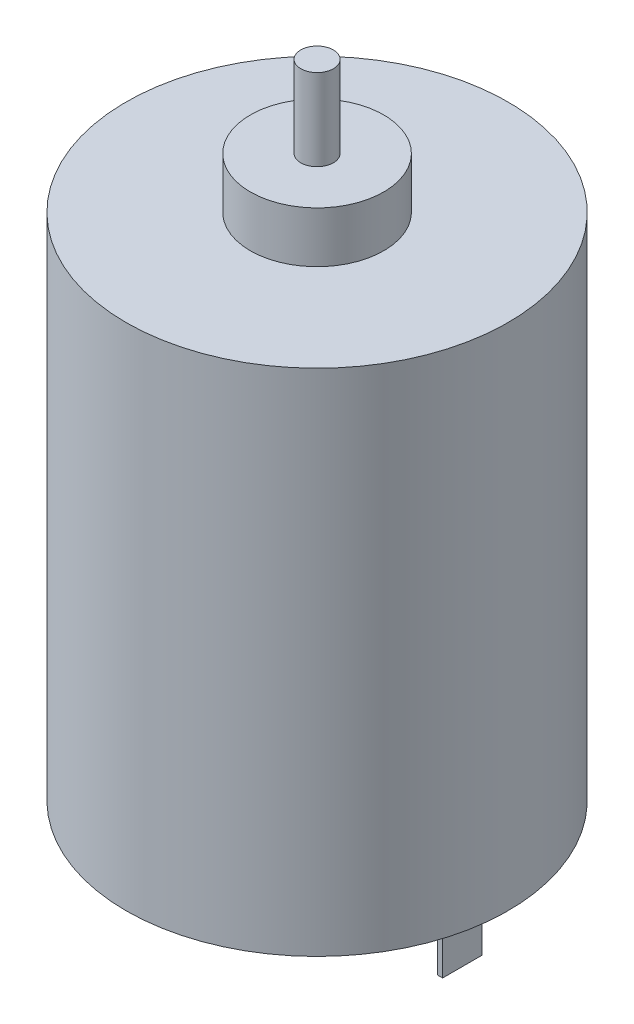
ISO-10303-21;
HEADER;
FILE_DESCRIPTION(('STEP AP214'),'2;1');
FILE_NAME('part.step','',(''),(''),'','','');
FILE_SCHEMA(('AUTOMOTIVE_DESIGN { 1 0 10303 214 1 1 1 1 }'));
ENDSEC;
DATA;
#1=APPLICATION_CONTEXT('core data for automotive mechanical design processes');
#2=APPLICATION_PROTOCOL_DEFINITION('international standard','automotive_design',2000,#1);
#3=PRODUCT_CONTEXT('',#1,'mechanical');
#4=PRODUCT('Part','Part','',(#3));
#5=PRODUCT_RELATED_PRODUCT_CATEGORY('part','',(#4));
#6=PRODUCT_DEFINITION_FORMATION('','',#4);
#7=PRODUCT_DEFINITION_CONTEXT('part definition',#1,'design');
#8=PRODUCT_DEFINITION('design','',#6,#7);
#9=PRODUCT_DEFINITION_SHAPE('','',#8);
#10=(LENGTH_UNIT() NAMED_UNIT(*) SI_UNIT(.MILLI.,.METRE.));
#11=(NAMED_UNIT(*) PLANE_ANGLE_UNIT() SI_UNIT($,.RADIAN.));
#12=(NAMED_UNIT(*) SI_UNIT($,.STERADIAN.) SOLID_ANGLE_UNIT());
#13=UNCERTAINTY_MEASURE_WITH_UNIT(LENGTH_MEASURE(1.E-05),#10,'distance_accuracy_value','');
#14=(GEOMETRIC_REPRESENTATION_CONTEXT(3) GLOBAL_UNCERTAINTY_ASSIGNED_CONTEXT((#13)) GLOBAL_UNIT_ASSIGNED_CONTEXT((#10,
#11,#12)) REPRESENTATION_CONTEXT('',''));
#15=CARTESIAN_POINT('',(0.,0.,0.));
#16=DIRECTION('',(0.,0.,1.));
#17=DIRECTION('',(1.,0.,0.));
#18=AXIS2_PLACEMENT_3D('',#15,#16,#17);
#19=CARTESIAN_POINT('',(0.,0.,0.));
#20=DIRECTION('',(0.,1.,0.));
#21=DIRECTION('',(0.,0.,1.));
#22=AXIS2_PLACEMENT_3D('',#19,#20,#21);
#23=PLANE('',#22);
#24=DIRECTION('',(0.,0.,-1.));
#25=VECTOR('',#24,1.);
#26=CARTESIAN_POINT('',(-14.25,0.,-1.92499999999999));
#27=LINE('',#26,#25);
#28=CARTESIAN_POINT('',(-14.25,0.,1.92500000000001));
#29=VERTEX_POINT('',#28);
#30=CARTESIAN_POINT('',(-14.25,0.,-1.92499999999999));
#31=VERTEX_POINT('',#30);
#32=EDGE_CURVE('E120',#29,#31,#27,.T.);
#33=ORIENTED_EDGE('',*,*,#32,.F.);
#34=DIRECTION('',(-1.,0.,0.));
#35=VECTOR('',#34,1.);
#36=CARTESIAN_POINT('',(-13.75,0.,1.92500000000001));
#37=LINE('',#36,#35);
#38=CARTESIAN_POINT('',(-13.75,0.,1.92500000000001));
#39=VERTEX_POINT('',#38);
#40=EDGE_CURVE('E133',#39,#29,#37,.T.);
#41=ORIENTED_EDGE('',*,*,#40,.F.);
#42=DIRECTION('',(0.,0.,1.));
#43=VECTOR('',#42,1.);
#44=CARTESIAN_POINT('',(-13.75,0.,-1.92499999999999));
#45=LINE('',#44,#43);
#46=CARTESIAN_POINT('',(-13.75,0.,-1.92499999999999));
#47=VERTEX_POINT('',#46);
#48=EDGE_CURVE('E142',#47,#39,#45,.T.);
#49=ORIENTED_EDGE('',*,*,#48,.F.);
#50=DIRECTION('',(1.,0.,0.));
#51=VECTOR('',#50,1.);
#52=CARTESIAN_POINT('',(-13.75,0.,-1.92499999999999));
#53=LINE('',#52,#51);
#54=EDGE_CURVE('E123',#31,#47,#53,.T.);
#55=ORIENTED_EDGE('',*,*,#54,.F.);
#56=EDGE_LOOP('',(#33,#41,#49,#55));
#57=FACE_BOUND('',#56,.T.);
#58=CARTESIAN_POINT('',(0.,0.,0.));
#59=DIRECTION('',(0.,1.,0.));
#60=DIRECTION('',(0.,0.,1.));
#61=AXIS2_PLACEMENT_3D('',#58,#59,#60);
#62=CIRCLE('',#61,6.5);
#63=CARTESIAN_POINT('',(0.,0.,6.5));
#64=VERTEX_POINT('',#63);
#65=EDGE_CURVE('E11',#64,#64,#62,.F.);
#66=ORIENTED_EDGE('',*,*,#65,.F.);
#67=EDGE_LOOP('',(#66));
#68=FACE_BOUND('',#67,.T.);
#69=CARTESIAN_POINT('',(0.,0.,0.));
#70=DIRECTION('',(0.,1.,0.));
#71=DIRECTION('',(0.,0.,1.));
#72=AXIS2_PLACEMENT_3D('',#69,#70,#71);
#73=CIRCLE('',#72,18.75);
#74=CARTESIAN_POINT('',(0.,0.,18.75));
#75=VERTEX_POINT('',#74);
#76=EDGE_CURVE('E177',#75,#75,#73,.T.);
#77=ORIENTED_EDGE('',*,*,#76,.F.);
#78=EDGE_LOOP('',(#77));
#79=FACE_BOUND('',#78,.T.);
#80=DIRECTION('',(0.,0.,-1.));
#81=VECTOR('',#80,1.);
#82=CARTESIAN_POINT('',(13.75,0.,-1.925));
#83=LINE('',#82,#81);
#84=CARTESIAN_POINT('',(13.75,0.,1.925));
#85=VERTEX_POINT('',#84);
#86=CARTESIAN_POINT('',(13.75,0.,-1.925));
#87=VERTEX_POINT('',#86);
#88=EDGE_CURVE('E119',#85,#87,#83,.T.);
#89=ORIENTED_EDGE('',*,*,#88,.F.);
#90=DIRECTION('',(-1.,0.,0.));
#91=VECTOR('',#90,1.);
#92=CARTESIAN_POINT('',(14.25,0.,1.925));
#93=LINE('',#92,#91);
#94=CARTESIAN_POINT('',(14.25,0.,1.925));
#95=VERTEX_POINT('',#94);
#96=EDGE_CURVE('E116',#95,#85,#93,.T.);
#97=ORIENTED_EDGE('',*,*,#96,.F.);
#98=DIRECTION('',(0.,0.,1.));
#99=VECTOR('',#98,1.);
#100=CARTESIAN_POINT('',(14.25,0.,-1.925));
#101=LINE('',#100,#99);
#102=CARTESIAN_POINT('',(14.25,0.,-1.925));
#103=VERTEX_POINT('',#102);
#104=EDGE_CURVE('E54',#103,#95,#101,.T.);
#105=ORIENTED_EDGE('',*,*,#104,.F.);
#106=DIRECTION('',(1.,0.,0.));
#107=VECTOR('',#106,1.);
#108=CARTESIAN_POINT('',(14.25,0.,-1.925));
#109=LINE('',#108,#107);
#110=EDGE_CURVE('E49',#87,#103,#109,.T.);
#111=ORIENTED_EDGE('',*,*,#110,.F.);
#112=EDGE_LOOP('',(#89,#97,#105,#111));
#113=FACE_BOUND('',#112,.T.);
#114=ADVANCED_FACE('F34',(#57,#68,#79,#113),#23,.F.);
#115=CARTESIAN_POINT('',(0.,50.,0.));
#116=DIRECTION('',(0.,-1.,0.));
#117=DIRECTION('',(0.,0.,-1.));
#118=AXIS2_PLACEMENT_3D('',#115,#116,#117);
#119=CYLINDRICAL_SURFACE('',#118,18.75);
#120=CARTESIAN_POINT('',(0.,50.,0.));
#121=DIRECTION('',(0.,1.,0.));
#122=DIRECTION('',(0.,0.,1.));
#123=AXIS2_PLACEMENT_3D('',#120,#121,#122);
#124=CIRCLE('',#123,18.75);
#125=CARTESIAN_POINT('',(0.,50.,18.75));
#126=VERTEX_POINT('',#125);
#127=EDGE_CURVE('E42',#126,#126,#124,.T.);
#128=ORIENTED_EDGE('',*,*,#127,.F.);
#129=EDGE_LOOP('',(#128));
#130=FACE_BOUND('',#129,.T.);
#131=ORIENTED_EDGE('',*,*,#76,.T.);
#132=EDGE_LOOP('',(#131));
#133=FACE_BOUND('',#132,.T.);
#134=ADVANCED_FACE('F36',(#130,#133),#119,.T.);
#135=CARTESIAN_POINT('',(0.,50.,0.));
#136=DIRECTION('',(0.,1.,0.));
#137=DIRECTION('',(0.,0.,1.));
#138=AXIS2_PLACEMENT_3D('',#135,#136,#137);
#139=PLANE('',#138);
#140=CARTESIAN_POINT('',(0.,50.,0.));
#141=DIRECTION('',(0.,1.,0.));
#142=DIRECTION('',(0.,0.,1.));
#143=AXIS2_PLACEMENT_3D('',#140,#141,#142);
#144=CIRCLE('',#143,6.55);
#145=CARTESIAN_POINT('',(0.,50.,6.55));
#146=VERTEX_POINT('',#145);
#147=EDGE_CURVE('E171',#146,#146,#144,.T.);
#148=ORIENTED_EDGE('',*,*,#147,.F.);
#149=EDGE_LOOP('',(#148));
#150=FACE_BOUND('',#149,.T.);
#151=ORIENTED_EDGE('',*,*,#127,.T.);
#152=EDGE_LOOP('',(#151));
#153=FACE_BOUND('',#152,.T.);
#154=ADVANCED_FACE('F265',(#150,#153),#139,.T.);
#155=CARTESIAN_POINT('',(0.,55.,0.));
#156=DIRECTION('',(0.,-1.,0.));
#157=DIRECTION('',(0.,0.,-1.));
#158=AXIS2_PLACEMENT_3D('',#155,#156,#157);
#159=CYLINDRICAL_SURFACE('',#158,6.55);
#160=CARTESIAN_POINT('',(0.,55.,0.));
#161=DIRECTION('',(0.,1.,0.));
#162=DIRECTION('',(0.,0.,1.));
#163=AXIS2_PLACEMENT_3D('',#160,#161,#162);
#164=CIRCLE('',#163,6.55);
#165=CARTESIAN_POINT('',(0.,55.,6.55));
#166=VERTEX_POINT('',#165);
#167=EDGE_CURVE('E174',#166,#166,#164,.T.);
#168=ORIENTED_EDGE('',*,*,#167,.F.);
#169=EDGE_LOOP('',(#168));
#170=FACE_BOUND('',#169,.T.);
#171=ORIENTED_EDGE('',*,*,#147,.T.);
#172=EDGE_LOOP('',(#171));
#173=FACE_BOUND('',#172,.T.);
#174=ADVANCED_FACE('F261',(#170,#173),#159,.T.);
#175=CARTESIAN_POINT('',(0.,55.,0.));
#176=DIRECTION('',(0.,1.,0.));
#177=DIRECTION('',(0.,0.,1.));
#178=AXIS2_PLACEMENT_3D('',#175,#176,#177);
#179=PLANE('',#178);
#180=CARTESIAN_POINT('',(0.,55.,0.));
#181=DIRECTION('',(0.,1.,0.));
#182=DIRECTION('',(0.,0.,1.));
#183=AXIS2_PLACEMENT_3D('',#180,#181,#182);
#184=CIRCLE('',#183,1.6);
#185=CARTESIAN_POINT('',(0.,55.,1.6));
#186=VERTEX_POINT('',#185);
#187=EDGE_CURVE('E167',#186,#186,#184,.T.);
#188=ORIENTED_EDGE('',*,*,#187,.F.);
#189=EDGE_LOOP('',(#188));
#190=FACE_BOUND('',#189,.T.);
#191=ORIENTED_EDGE('',*,*,#167,.T.);
#192=EDGE_LOOP('',(#191));
#193=FACE_BOUND('',#192,.T.);
#194=ADVANCED_FACE('F257',(#190,#193),#179,.T.);
#195=CARTESIAN_POINT('',(0.,63.,0.));
#196=DIRECTION('',(0.,-1.,0.));
#197=DIRECTION('',(0.,0.,-1.));
#198=AXIS2_PLACEMENT_3D('',#195,#196,#197);
#199=CYLINDRICAL_SURFACE('',#198,1.6);
#200=CARTESIAN_POINT('',(0.,63.,0.));
#201=DIRECTION('',(0.,1.,0.));
#202=DIRECTION('',(0.,0.,1.));
#203=AXIS2_PLACEMENT_3D('',#200,#201,#202);
#204=CIRCLE('',#203,1.6);
#205=CARTESIAN_POINT('',(0.,63.,1.6));
#206=VERTEX_POINT('',#205);
#207=EDGE_CURVE('E168',#206,#206,#204,.T.);
#208=ORIENTED_EDGE('',*,*,#207,.F.);
#209=EDGE_LOOP('',(#208));
#210=FACE_BOUND('',#209,.T.);
#211=ORIENTED_EDGE('',*,*,#187,.T.);
#212=EDGE_LOOP('',(#211));
#213=FACE_BOUND('',#212,.T.);
#214=ADVANCED_FACE('F253',(#210,#213),#199,.T.);
#215=CARTESIAN_POINT('',(0.,63.,0.));
#216=DIRECTION('',(0.,1.,0.));
#217=DIRECTION('',(0.,0.,1.));
#218=AXIS2_PLACEMENT_3D('',#215,#216,#217);
#219=PLANE('',#218);
#220=ORIENTED_EDGE('',*,*,#207,.T.);
#221=EDGE_LOOP('',(#220));
#222=FACE_BOUND('',#221,.T.);
#223=ADVANCED_FACE('F249',(#222),#219,.T.);
#224=CARTESIAN_POINT('',(0.,-2.5,0.));
#225=DIRECTION('',(0.,1.,0.));
#226=DIRECTION('',(0.,0.,1.));
#227=AXIS2_PLACEMENT_3D('',#224,#225,#226);
#228=CYLINDRICAL_SURFACE('',#227,6.5);
#229=CARTESIAN_POINT('',(0.,-2.5,0.));
#230=DIRECTION('',(0.,-1.,0.));
#231=DIRECTION('',(0.,0.,-1.));
#232=AXIS2_PLACEMENT_3D('',#229,#230,#231);
#233=CIRCLE('',#232,6.5);
#234=CARTESIAN_POINT('',(0.,-2.5,-6.5));
#235=VERTEX_POINT('',#234);
#236=EDGE_CURVE('E162',#235,#235,#233,.T.);
#237=ORIENTED_EDGE('',*,*,#236,.F.);
#238=EDGE_LOOP('',(#237));
#239=FACE_BOUND('',#238,.T.);
#240=ORIENTED_EDGE('',*,*,#65,.T.);
#241=EDGE_LOOP('',(#240));
#242=FACE_BOUND('',#241,.T.);
#243=ADVANCED_FACE('F245',(#239,#242),#228,.T.);
#244=CARTESIAN_POINT('',(0.,-2.5,0.));
#245=DIRECTION('',(0.,-1.,0.));
#246=DIRECTION('',(0.,0.,-1.));
#247=AXIS2_PLACEMENT_3D('',#244,#245,#246);
#248=PLANE('',#247);
#249=CARTESIAN_POINT('',(0.,-2.5,0.));
#250=DIRECTION('',(0.,-1.,0.));
#251=DIRECTION('',(0.,0.,-1.));
#252=AXIS2_PLACEMENT_3D('',#249,#250,#251);
#253=CIRCLE('',#252,4.);
#254=CARTESIAN_POINT('',(0.,-2.5,-4.));
#255=VERTEX_POINT('',#254);
#256=EDGE_CURVE('E158',#255,#255,#253,.T.);
#257=ORIENTED_EDGE('',*,*,#256,.F.);
#258=EDGE_LOOP('',(#257));
#259=FACE_BOUND('',#258,.T.);
#260=ORIENTED_EDGE('',*,*,#236,.T.);
#261=EDGE_LOOP('',(#260));
#262=FACE_BOUND('',#261,.T.);
#263=ADVANCED_FACE('F241',(#259,#262),#248,.T.);
#264=CARTESIAN_POINT('',(0.,-3.8,0.));
#265=DIRECTION('',(0.,1.,0.));
#266=DIRECTION('',(0.,0.,1.));
#267=AXIS2_PLACEMENT_3D('',#264,#265,#266);
#268=CYLINDRICAL_SURFACE('',#267,4.);
#269=CARTESIAN_POINT('',(0.,-3.8,0.));
#270=DIRECTION('',(0.,-1.,0.));
#271=DIRECTION('',(0.,0.,-1.));
#272=AXIS2_PLACEMENT_3D('',#269,#270,#271);
#273=CIRCLE('',#272,4.);
#274=CARTESIAN_POINT('',(0.,-3.8,-4.));
#275=VERTEX_POINT('',#274);
#276=EDGE_CURVE('E159',#275,#275,#273,.T.);
#277=ORIENTED_EDGE('',*,*,#276,.F.);
#278=EDGE_LOOP('',(#277));
#279=FACE_BOUND('',#278,.T.);
#280=ORIENTED_EDGE('',*,*,#256,.T.);
#281=EDGE_LOOP('',(#280));
#282=FACE_BOUND('',#281,.T.);
#283=ADVANCED_FACE('F237',(#279,#282),#268,.T.);
#284=CARTESIAN_POINT('',(0.,-3.8,0.));
#285=DIRECTION('',(0.,-1.,0.));
#286=DIRECTION('',(0.,0.,-1.));
#287=AXIS2_PLACEMENT_3D('',#284,#285,#286);
#288=PLANE('',#287);
#289=ORIENTED_EDGE('',*,*,#276,.T.);
#290=EDGE_LOOP('',(#289));
#291=FACE_BOUND('',#290,.T.);
#292=ADVANCED_FACE('F233',(#291),#288,.T.);
#293=CARTESIAN_POINT('',(-14.25,-7.,-1.92499999999999));
#294=DIRECTION('',(1.,0.,0.));
#295=DIRECTION('',(0.,0.,-1.));
#296=AXIS2_PLACEMENT_3D('',#293,#294,#295);
#297=PLANE('',#296);
#298=ORIENTED_EDGE('',*,*,#32,.T.);
#299=DIRECTION('',(0.,1.,0.));
#300=VECTOR('',#299,1.);
#301=CARTESIAN_POINT('',(-14.25,-7.,-1.92499999999999));
#302=LINE('',#301,#300);
#303=CARTESIAN_POINT('',(-14.25,-7.,-1.92499999999999));
#304=VERTEX_POINT('',#303);
#305=EDGE_CURVE('E155',#304,#31,#302,.T.);
#306=ORIENTED_EDGE('',*,*,#305,.F.);
#307=DIRECTION('',(0.,0.,-1.));
#308=VECTOR('',#307,1.);
#309=CARTESIAN_POINT('',(-14.25,-7.,-1.92499999999999));
#310=LINE('',#309,#308);
#311=CARTESIAN_POINT('',(-14.25,-7.,1.92500000000001));
#312=VERTEX_POINT('',#311);
#313=EDGE_CURVE('E129',#312,#304,#310,.T.);
#314=ORIENTED_EDGE('',*,*,#313,.F.);
#315=DIRECTION('',(0.,1.,0.));
#316=VECTOR('',#315,1.);
#317=CARTESIAN_POINT('',(-14.25,-7.,1.92500000000001));
#318=LINE('',#317,#316);
#319=EDGE_CURVE('E138',#312,#29,#318,.T.);
#320=ORIENTED_EDGE('',*,*,#319,.T.);
#321=EDGE_LOOP('',(#298,#306,#314,#320));
#322=FACE_BOUND('',#321,.T.);
#323=ADVANCED_FACE('F229',(#322),#297,.F.);
#324=CARTESIAN_POINT('',(-13.75,-7.,-1.92499999999999));
#325=DIRECTION('',(0.,0.,1.));
#326=DIRECTION('',(1.,0.,0.));
#327=AXIS2_PLACEMENT_3D('',#324,#325,#326);
#328=PLANE('',#327);
#329=ORIENTED_EDGE('',*,*,#54,.T.);
#330=DIRECTION('',(0.,1.,0.));
#331=VECTOR('',#330,1.);
#332=CARTESIAN_POINT('',(-13.75,-7.,-1.92499999999999));
#333=LINE('',#332,#331);
#334=CARTESIAN_POINT('',(-13.75,-7.,-1.92499999999999));
#335=VERTEX_POINT('',#334);
#336=EDGE_CURVE('E152',#335,#47,#333,.T.);
#337=ORIENTED_EDGE('',*,*,#336,.F.);
#338=DIRECTION('',(1.,0.,0.));
#339=VECTOR('',#338,1.);
#340=CARTESIAN_POINT('',(-13.75,-7.,-1.92499999999999));
#341=LINE('',#340,#339);
#342=EDGE_CURVE('E132',#304,#335,#341,.T.);
#343=ORIENTED_EDGE('',*,*,#342,.F.);
#344=ORIENTED_EDGE('',*,*,#305,.T.);
#345=EDGE_LOOP('',(#329,#337,#343,#344));
#346=FACE_BOUND('',#345,.T.);
#347=ADVANCED_FACE('F225',(#346),#328,.F.);
#348=CARTESIAN_POINT('',(-13.75,-7.,-1.92499999999999));
#349=DIRECTION('',(-1.,0.,0.));
#350=DIRECTION('',(0.,0.,1.));
#351=AXIS2_PLACEMENT_3D('',#348,#349,#350);
#352=PLANE('',#351);
#353=ORIENTED_EDGE('',*,*,#48,.T.);
#354=DIRECTION('',(0.,1.,0.));
#355=VECTOR('',#354,1.);
#356=CARTESIAN_POINT('',(-13.75,-7.,1.92500000000001));
#357=LINE('',#356,#355);
#358=CARTESIAN_POINT('',(-13.75,-7.,1.92500000000001));
#359=VERTEX_POINT('',#358);
#360=EDGE_CURVE('E149',#359,#39,#357,.T.);
#361=ORIENTED_EDGE('',*,*,#360,.F.);
#362=DIRECTION('',(0.,0.,1.));
#363=VECTOR('',#362,1.);
#364=CARTESIAN_POINT('',(-13.75,-7.,-1.92499999999999));
#365=LINE('',#364,#363);
#366=EDGE_CURVE('E135',#335,#359,#365,.T.);
#367=ORIENTED_EDGE('',*,*,#366,.F.);
#368=ORIENTED_EDGE('',*,*,#336,.T.);
#369=EDGE_LOOP('',(#353,#361,#367,#368));
#370=FACE_BOUND('',#369,.T.);
#371=ADVANCED_FACE('F221',(#370),#352,.F.);
#372=CARTESIAN_POINT('',(-13.75,-7.,1.92500000000001));
#373=DIRECTION('',(0.,0.,-1.));
#374=DIRECTION('',(-1.,0.,0.));
#375=AXIS2_PLACEMENT_3D('',#372,#373,#374);
#376=PLANE('',#375);
#377=ORIENTED_EDGE('',*,*,#40,.T.);
#378=ORIENTED_EDGE('',*,*,#319,.F.);
#379=DIRECTION('',(-1.,0.,0.));
#380=VECTOR('',#379,1.);
#381=CARTESIAN_POINT('',(-13.75,-7.,1.92500000000001));
#382=LINE('',#381,#380);
#383=EDGE_CURVE('E137',#359,#312,#382,.T.);
#384=ORIENTED_EDGE('',*,*,#383,.F.);
#385=ORIENTED_EDGE('',*,*,#360,.T.);
#386=EDGE_LOOP('',(#377,#378,#384,#385));
#387=FACE_BOUND('',#386,.T.);
#388=ADVANCED_FACE('F217',(#387),#376,.F.);
#389=CARTESIAN_POINT('',(0.,-7.,0.));
#390=DIRECTION('',(0.,-1.,0.));
#391=DIRECTION('',(0.,0.,-1.));
#392=AXIS2_PLACEMENT_3D('',#389,#390,#391);
#393=PLANE('',#392);
#394=ORIENTED_EDGE('',*,*,#313,.T.);
#395=ORIENTED_EDGE('',*,*,#342,.T.);
#396=ORIENTED_EDGE('',*,*,#366,.T.);
#397=ORIENTED_EDGE('',*,*,#383,.T.);
#398=EDGE_LOOP('',(#394,#395,#396,#397));
#399=FACE_BOUND('',#398,.T.);
#400=ADVANCED_FACE('F214',(#399),#393,.T.);
#401=CARTESIAN_POINT('',(13.75,-7.,-1.925));
#402=DIRECTION('',(1.,0.,0.));
#403=DIRECTION('',(0.,0.,-1.));
#404=AXIS2_PLACEMENT_3D('',#401,#402,#403);
#405=PLANE('',#404);
#406=ORIENTED_EDGE('',*,*,#88,.T.);
#407=DIRECTION('',(0.,1.,0.));
#408=VECTOR('',#407,1.);
#409=CARTESIAN_POINT('',(13.75,-7.,-1.925));
#410=LINE('',#409,#408);
#411=CARTESIAN_POINT('',(13.75,-7.,-1.925));
#412=VERTEX_POINT('',#411);
#413=EDGE_CURVE('E100',#412,#87,#410,.T.);
#414=ORIENTED_EDGE('',*,*,#413,.F.);
#415=DIRECTION('',(0.,0.,-1.));
#416=VECTOR('',#415,1.);
#417=CARTESIAN_POINT('',(13.75,-7.,-1.925));
#418=LINE('',#417,#416);
#419=CARTESIAN_POINT('',(13.75,-7.,1.925));
#420=VERTEX_POINT('',#419);
#421=EDGE_CURVE('E107',#420,#412,#418,.T.);
#422=ORIENTED_EDGE('',*,*,#421,.F.);
#423=DIRECTION('',(0.,1.,0.));
#424=VECTOR('',#423,1.);
#425=CARTESIAN_POINT('',(13.75,-7.,1.925));
#426=LINE('',#425,#424);
#427=EDGE_CURVE('E192',#420,#85,#426,.T.);
#428=ORIENTED_EDGE('',*,*,#427,.T.);
#429=EDGE_LOOP('',(#406,#414,#422,#428));
#430=FACE_BOUND('',#429,.T.);
#431=ADVANCED_FACE('F118',(#430),#405,.F.);
#432=CARTESIAN_POINT('',(14.25,-7.,-1.925));
#433=DIRECTION('',(0.,0.,1.));
#434=DIRECTION('',(1.,0.,0.));
#435=AXIS2_PLACEMENT_3D('',#432,#433,#434);
#436=PLANE('',#435);
#437=ORIENTED_EDGE('',*,*,#110,.T.);
#438=DIRECTION('',(0.,1.,0.));
#439=VECTOR('',#438,1.);
#440=CARTESIAN_POINT('',(14.25,-7.,-1.925));
#441=LINE('',#440,#439);
#442=CARTESIAN_POINT('',(14.25,-7.,-1.925));
#443=VERTEX_POINT('',#442);
#444=EDGE_CURVE('E103',#443,#103,#441,.T.);
#445=ORIENTED_EDGE('',*,*,#444,.F.);
#446=DIRECTION('',(1.,0.,0.));
#447=VECTOR('',#446,1.);
#448=CARTESIAN_POINT('',(14.25,-7.,-1.925));
#449=LINE('',#448,#447);
#450=EDGE_CURVE('E96',#412,#443,#449,.T.);
#451=ORIENTED_EDGE('',*,*,#450,.F.);
#452=ORIENTED_EDGE('',*,*,#413,.T.);
#453=EDGE_LOOP('',(#437,#445,#451,#452));
#454=FACE_BOUND('',#453,.T.);
#455=ADVANCED_FACE('F98',(#454),#436,.F.);
#456=CARTESIAN_POINT('',(14.25,-7.,-1.925));
#457=DIRECTION('',(-1.,0.,0.));
#458=DIRECTION('',(0.,0.,1.));
#459=AXIS2_PLACEMENT_3D('',#456,#457,#458);
#460=PLANE('',#459);
#461=ORIENTED_EDGE('',*,*,#104,.T.);
#462=DIRECTION('',(0.,1.,0.));
#463=VECTOR('',#462,1.);
#464=CARTESIAN_POINT('',(14.25,-7.,1.925));
#465=LINE('',#464,#463);
#466=CARTESIAN_POINT('',(14.25,-7.,1.925));
#467=VERTEX_POINT('',#466);
#468=EDGE_CURVE('E125',#467,#95,#465,.T.);
#469=ORIENTED_EDGE('',*,*,#468,.F.);
#470=DIRECTION('',(0.,0.,1.));
#471=VECTOR('',#470,1.);
#472=CARTESIAN_POINT('',(14.25,-7.,-1.925));
#473=LINE('',#472,#471);
#474=EDGE_CURVE('E106',#443,#467,#473,.T.);
#475=ORIENTED_EDGE('',*,*,#474,.F.);
#476=ORIENTED_EDGE('',*,*,#444,.T.);
#477=EDGE_LOOP('',(#461,#469,#475,#476));
#478=FACE_BOUND('',#477,.T.);
#479=ADVANCED_FACE('F201',(#478),#460,.F.);
#480=CARTESIAN_POINT('',(14.25,-7.,1.925));
#481=DIRECTION('',(0.,0.,-1.));
#482=DIRECTION('',(-1.,0.,0.));
#483=AXIS2_PLACEMENT_3D('',#480,#481,#482);
#484=PLANE('',#483);
#485=ORIENTED_EDGE('',*,*,#96,.T.);
#486=ORIENTED_EDGE('',*,*,#427,.F.);
#487=DIRECTION('',(-1.,0.,0.));
#488=VECTOR('',#487,1.);
#489=CARTESIAN_POINT('',(14.25,-7.,1.925));
#490=LINE('',#489,#488);
#491=EDGE_CURVE('E112',#467,#420,#490,.T.);
#492=ORIENTED_EDGE('',*,*,#491,.F.);
#493=ORIENTED_EDGE('',*,*,#468,.T.);
#494=EDGE_LOOP('',(#485,#486,#492,#493));
#495=FACE_BOUND('',#494,.T.);
#496=ADVANCED_FACE('F191',(#495),#484,.F.);
#497=CARTESIAN_POINT('',(0.,-7.,0.));
#498=DIRECTION('',(0.,-1.,0.));
#499=DIRECTION('',(0.,0.,-1.));
#500=AXIS2_PLACEMENT_3D('',#497,#498,#499);
#501=PLANE('',#500);
#502=ORIENTED_EDGE('',*,*,#421,.T.);
#503=ORIENTED_EDGE('',*,*,#450,.T.);
#504=ORIENTED_EDGE('',*,*,#474,.T.);
#505=ORIENTED_EDGE('',*,*,#491,.T.);
#506=EDGE_LOOP('',(#502,#503,#504,#505));
#507=FACE_BOUND('',#506,.T.);
#508=ADVANCED_FACE('F110',(#507),#501,.T.);
#509=CLOSED_SHELL('',(#114,#134,#154,#174,#194,#214,#223,#243,#263,#283,#292,#323,#347,#371,
#388,#400,#431,#455,#479,#496,#508));
#510=MANIFOLD_SOLID_BREP('B2',#509);
#511=ADVANCED_BREP_SHAPE_REPRESENTATION('',(#18,#510),#14);
#512=SHAPE_DEFINITION_REPRESENTATION(#9,#511);
ENDSEC;
END-ISO-10303-21;
